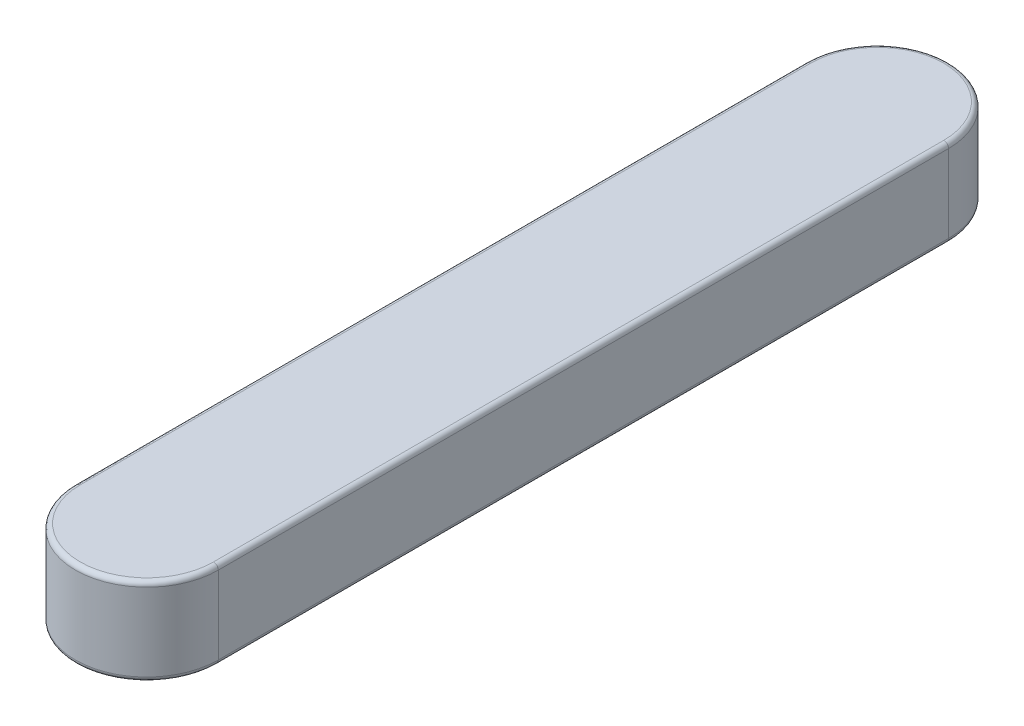
ISO-10303-21;
HEADER;
FILE_DESCRIPTION(('STEP AP214'),'2;1');
FILE_NAME('part.step','',(''),(''),'','','');
FILE_SCHEMA(('AUTOMOTIVE_DESIGN { 1 0 10303 214 1 1 1 1 }'));
ENDSEC;
DATA;
#1=APPLICATION_CONTEXT('core data for automotive mechanical design processes');
#2=APPLICATION_PROTOCOL_DEFINITION('international standard','automotive_design',2000,#1);
#3=PRODUCT_CONTEXT('',#1,'mechanical');
#4=PRODUCT('Part','Part','',(#3));
#5=PRODUCT_RELATED_PRODUCT_CATEGORY('part','',(#4));
#6=PRODUCT_DEFINITION_FORMATION('','',#4);
#7=PRODUCT_DEFINITION_CONTEXT('part definition',#1,'design');
#8=PRODUCT_DEFINITION('design','',#6,#7);
#9=PRODUCT_DEFINITION_SHAPE('','',#8);
#10=(LENGTH_UNIT() NAMED_UNIT(*) SI_UNIT(.MILLI.,.METRE.));
#11=(NAMED_UNIT(*) PLANE_ANGLE_UNIT() SI_UNIT($,.RADIAN.));
#12=(NAMED_UNIT(*) SI_UNIT($,.STERADIAN.) SOLID_ANGLE_UNIT());
#13=UNCERTAINTY_MEASURE_WITH_UNIT(LENGTH_MEASURE(1.E-05),#10,'distance_accuracy_value','');
#14=(GEOMETRIC_REPRESENTATION_CONTEXT(3) GLOBAL_UNCERTAINTY_ASSIGNED_CONTEXT((#13)) GLOBAL_UNIT_ASSIGNED_CONTEXT((#10,
#11,#12)) REPRESENTATION_CONTEXT('',''));
#15=CARTESIAN_POINT('',(0.,0.,0.));
#16=DIRECTION('',(0.,0.,1.));
#17=DIRECTION('',(1.,0.,0.));
#18=AXIS2_PLACEMENT_3D('',#15,#16,#17);
#19=CARTESIAN_POINT('',(0.,11.,0.));
#20=DIRECTION('',(0.,-1.,0.));
#21=DIRECTION('',(0.,0.,-1.));
#22=AXIS2_PLACEMENT_3D('',#19,#20,#21);
#23=CYLINDRICAL_SURFACE('',#22,9.);
#24=DIRECTION('',(0.,-1.,0.));
#25=VECTOR('',#24,1.);
#26=CARTESIAN_POINT('',(-9.,11.,0.));
#27=LINE('',#26,#25);
#28=CARTESIAN_POINT('',(-9.,10.4,0.));
#29=VERTEX_POINT('',#28);
#30=CARTESIAN_POINT('',(-9.,0.6,0.));
#31=VERTEX_POINT('',#30);
#32=EDGE_CURVE('E172',#29,#31,#27,.T.);
#33=ORIENTED_EDGE('',*,*,#32,.T.);
#34=CARTESIAN_POINT('',(0.,0.6,0.));
#35=DIRECTION('',(0.,1.,0.));
#36=DIRECTION('',(0.,0.,1.));
#37=AXIS2_PLACEMENT_3D('',#34,#35,#36);
#38=CIRCLE('',#37,9.);
#39=CARTESIAN_POINT('',(9.,0.6,0.));
#40=VERTEX_POINT('',#39);
#41=EDGE_CURVE('E186',#31,#40,#38,.T.);
#42=ORIENTED_EDGE('',*,*,#41,.T.);
#43=DIRECTION('',(0.,-1.,0.));
#44=VECTOR('',#43,1.);
#45=CARTESIAN_POINT('',(9.,11.,0.));
#46=LINE('',#45,#44);
#47=CARTESIAN_POINT('',(9.,10.4,0.));
#48=VERTEX_POINT('',#47);
#49=EDGE_CURVE('E141',#48,#40,#46,.T.);
#50=ORIENTED_EDGE('',*,*,#49,.F.);
#51=CARTESIAN_POINT('',(0.,10.4,0.));
#52=DIRECTION('',(0.,1.,0.));
#53=DIRECTION('',(0.,0.,1.));
#54=AXIS2_PLACEMENT_3D('',#51,#52,#53);
#55=CIRCLE('',#54,9.);
#56=EDGE_CURVE('E189',#48,#29,#55,.F.);
#57=ORIENTED_EDGE('',*,*,#56,.T.);
#58=EDGE_LOOP('',(#33,#42,#50,#57));
#59=FACE_BOUND('',#58,.T.);
#60=ADVANCED_FACE('F51',(#59),#23,.T.);
#61=CARTESIAN_POINT('',(9.,11.,0.));
#62=DIRECTION('',(-1.,0.,0.));
#63=DIRECTION('',(0.,0.,1.));
#64=AXIS2_PLACEMENT_3D('',#61,#62,#63);
#65=PLANE('',#64);
#66=ORIENTED_EDGE('',*,*,#49,.T.);
#67=DIRECTION('',(0.,0.,-1.));
#68=VECTOR('',#67,1.);
#69=CARTESIAN_POINT('',(9.,0.6,0.));
#70=LINE('',#69,#68);
#71=CARTESIAN_POINT('',(9.,0.6,-92.));
#72=VERTEX_POINT('',#71);
#73=EDGE_CURVE('E139',#40,#72,#70,.T.);
#74=ORIENTED_EDGE('',*,*,#73,.T.);
#75=DIRECTION('',(0.,-1.,0.));
#76=VECTOR('',#75,1.);
#77=CARTESIAN_POINT('',(9.,11.,-92.));
#78=LINE('',#77,#76);
#79=CARTESIAN_POINT('',(9.,10.4,-92.));
#80=VERTEX_POINT('',#79);
#81=EDGE_CURVE('E121',#80,#72,#78,.T.);
#82=ORIENTED_EDGE('',*,*,#81,.F.);
#83=DIRECTION('',(0.,0.,-1.));
#84=VECTOR('',#83,1.);
#85=CARTESIAN_POINT('',(9.,10.4,0.));
#86=LINE('',#85,#84);
#87=EDGE_CURVE('E136',#80,#48,#86,.F.);
#88=ORIENTED_EDGE('',*,*,#87,.T.);
#89=EDGE_LOOP('',(#66,#74,#82,#88));
#90=FACE_BOUND('',#89,.T.);
#91=ADVANCED_FACE('F135',(#90),#65,.F.);
#92=CARTESIAN_POINT('',(0.,11.,-92.));
#93=DIRECTION('',(0.,-1.,0.));
#94=DIRECTION('',(0.,0.,-1.));
#95=AXIS2_PLACEMENT_3D('',#92,#93,#94);
#96=CYLINDRICAL_SURFACE('',#95,9.);
#97=ORIENTED_EDGE('',*,*,#81,.T.);
#98=CARTESIAN_POINT('',(0.,0.6,-92.));
#99=DIRECTION('',(0.,1.,0.));
#100=DIRECTION('',(0.,0.,1.));
#101=AXIS2_PLACEMENT_3D('',#98,#99,#100);
#102=CIRCLE('',#101,9.);
#103=CARTESIAN_POINT('',(-9.,0.6,-92.));
#104=VERTEX_POINT('',#103);
#105=EDGE_CURVE('E128',#72,#104,#102,.T.);
#106=ORIENTED_EDGE('',*,*,#105,.T.);
#107=DIRECTION('',(0.,-1.,0.));
#108=VECTOR('',#107,1.);
#109=CARTESIAN_POINT('',(-9.,11.,-92.));
#110=LINE('',#109,#108);
#111=CARTESIAN_POINT('',(-9.,10.4,-92.));
#112=VERTEX_POINT('',#111);
#113=EDGE_CURVE('E123',#112,#104,#110,.T.);
#114=ORIENTED_EDGE('',*,*,#113,.F.);
#115=CARTESIAN_POINT('',(0.,10.4,-92.));
#116=DIRECTION('',(0.,1.,0.));
#117=DIRECTION('',(0.,0.,1.));
#118=AXIS2_PLACEMENT_3D('',#115,#116,#117);
#119=CIRCLE('',#118,9.);
#120=EDGE_CURVE('E118',#112,#80,#119,.F.);
#121=ORIENTED_EDGE('',*,*,#120,.T.);
#122=EDGE_LOOP('',(#97,#106,#114,#121));
#123=FACE_BOUND('',#122,.T.);
#124=ADVANCED_FACE('F120',(#123),#96,.T.);
#125=CARTESIAN_POINT('',(-9.,11.,0.));
#126=DIRECTION('',(1.,0.,0.));
#127=DIRECTION('',(0.,0.,-1.));
#128=AXIS2_PLACEMENT_3D('',#125,#126,#127);
#129=PLANE('',#128);
#130=ORIENTED_EDGE('',*,*,#113,.T.);
#131=DIRECTION('',(0.,0.,1.));
#132=VECTOR('',#131,1.);
#133=CARTESIAN_POINT('',(-9.,0.6,0.));
#134=LINE('',#133,#132);
#135=EDGE_CURVE('E192',#104,#31,#134,.T.);
#136=ORIENTED_EDGE('',*,*,#135,.T.);
#137=ORIENTED_EDGE('',*,*,#32,.F.);
#138=DIRECTION('',(0.,0.,1.));
#139=VECTOR('',#138,1.);
#140=CARTESIAN_POINT('',(-9.,10.4,-92.));
#141=LINE('',#140,#139);
#142=EDGE_CURVE('E195',#29,#112,#141,.F.);
#143=ORIENTED_EDGE('',*,*,#142,.T.);
#144=EDGE_LOOP('',(#130,#136,#137,#143));
#145=FACE_BOUND('',#144,.T.);
#146=ADVANCED_FACE('F244',(#145),#129,.F.);
#147=CARTESIAN_POINT('',(0.,11.,0.));
#148=DIRECTION('',(0.,1.,0.));
#149=DIRECTION('',(0.,0.,1.));
#150=AXIS2_PLACEMENT_3D('',#147,#148,#149);
#151=PLANE('',#150);
#152=CARTESIAN_POINT('',(0.,11.,-92.));
#153=DIRECTION('',(0.,1.,0.));
#154=DIRECTION('',(0.,0.,1.));
#155=AXIS2_PLACEMENT_3D('',#152,#153,#154);
#156=CIRCLE('',#155,8.4);
#157=CARTESIAN_POINT('',(8.4,11.,-92.));
#158=VERTEX_POINT('',#157);
#159=CARTESIAN_POINT('',(-8.4,11.,-92.));
#160=VERTEX_POINT('',#159);
#161=EDGE_CURVE('E61',#158,#160,#156,.T.);
#162=ORIENTED_EDGE('',*,*,#161,.T.);
#163=DIRECTION('',(0.,0.,1.));
#164=VECTOR('',#163,1.);
#165=CARTESIAN_POINT('',(-8.4,11.,0.));
#166=LINE('',#165,#164);
#167=CARTESIAN_POINT('',(-8.4,11.,0.));
#168=VERTEX_POINT('',#167);
#169=EDGE_CURVE('E11',#160,#168,#166,.T.);
#170=ORIENTED_EDGE('',*,*,#169,.T.);
#171=CARTESIAN_POINT('',(0.,11.,0.));
#172=DIRECTION('',(0.,1.,0.));
#173=DIRECTION('',(0.,0.,1.));
#174=AXIS2_PLACEMENT_3D('',#171,#172,#173);
#175=CIRCLE('',#174,8.4);
#176=CARTESIAN_POINT('',(8.4,11.,0.));
#177=VERTEX_POINT('',#176);
#178=EDGE_CURVE('E183',#168,#177,#175,.T.);
#179=ORIENTED_EDGE('',*,*,#178,.T.);
#180=DIRECTION('',(0.,0.,-1.));
#181=VECTOR('',#180,1.);
#182=CARTESIAN_POINT('',(8.4,11.,-92.));
#183=LINE('',#182,#181);
#184=EDGE_CURVE('E72',#177,#158,#183,.T.);
#185=ORIENTED_EDGE('',*,*,#184,.T.);
#186=EDGE_LOOP('',(#162,#170,#179,#185));
#187=FACE_BOUND('',#186,.T.);
#188=ADVANCED_FACE('F250',(#187),#151,.T.);
#189=CARTESIAN_POINT('',(0.,0.,0.));
#190=DIRECTION('',(0.,1.,0.));
#191=DIRECTION('',(0.,0.,1.));
#192=AXIS2_PLACEMENT_3D('',#189,#190,#191);
#193=PLANE('',#192);
#194=CARTESIAN_POINT('',(0.,0.,-92.));
#195=DIRECTION('',(0.,1.,0.));
#196=DIRECTION('',(0.,0.,1.));
#197=AXIS2_PLACEMENT_3D('',#194,#195,#196);
#198=CIRCLE('',#197,8.4);
#199=CARTESIAN_POINT('',(-8.4,0.,-92.));
#200=VERTEX_POINT('',#199);
#201=CARTESIAN_POINT('',(8.4,0.,-92.));
#202=VERTEX_POINT('',#201);
#203=EDGE_CURVE('E203',#200,#202,#198,.F.);
#204=ORIENTED_EDGE('',*,*,#203,.T.);
#205=DIRECTION('',(0.,0.,-1.));
#206=VECTOR('',#205,1.);
#207=CARTESIAN_POINT('',(8.4,0.,0.));
#208=LINE('',#207,#206);
#209=CARTESIAN_POINT('',(8.4,0.,0.));
#210=VERTEX_POINT('',#209);
#211=EDGE_CURVE('E129',#202,#210,#208,.F.);
#212=ORIENTED_EDGE('',*,*,#211,.T.);
#213=CARTESIAN_POINT('',(0.,0.,0.));
#214=DIRECTION('',(0.,1.,0.));
#215=DIRECTION('',(0.,0.,1.));
#216=AXIS2_PLACEMENT_3D('',#213,#214,#215);
#217=CIRCLE('',#216,8.4);
#218=CARTESIAN_POINT('',(-8.4,0.,0.));
#219=VERTEX_POINT('',#218);
#220=EDGE_CURVE('E209',#210,#219,#217,.F.);
#221=ORIENTED_EDGE('',*,*,#220,.T.);
#222=DIRECTION('',(0.,0.,1.));
#223=VECTOR('',#222,1.);
#224=CARTESIAN_POINT('',(-8.4,0.,0.));
#225=LINE('',#224,#223);
#226=EDGE_CURVE('E206',#219,#200,#225,.F.);
#227=ORIENTED_EDGE('',*,*,#226,.T.);
#228=EDGE_LOOP('',(#204,#212,#221,#227));
#229=FACE_BOUND('',#228,.T.);
#230=ADVANCED_FACE('F252',(#229),#193,.F.);
#231=CARTESIAN_POINT('',(-8.4,0.6,0.));
#232=DIRECTION('',(0.,0.,1.));
#233=DIRECTION('',(1.,0.,0.));
#234=AXIS2_PLACEMENT_3D('',#231,#232,#233);
#235=CYLINDRICAL_SURFACE('',#234,0.6);
#236=CARTESIAN_POINT('',(-8.4,0.6,-92.));
#237=DIRECTION('',(0.,0.,-1.));
#238=DIRECTION('',(-1.,0.,0.));
#239=AXIS2_PLACEMENT_3D('',#236,#237,#238);
#240=CIRCLE('',#239,0.6);
#241=EDGE_CURVE('E173',#200,#104,#240,.T.);
#242=ORIENTED_EDGE('',*,*,#241,.F.);
#243=ORIENTED_EDGE('',*,*,#226,.F.);
#244=CARTESIAN_POINT('',(-8.4,0.6,0.));
#245=DIRECTION('',(0.,0.,1.));
#246=DIRECTION('',(1.,0.,0.));
#247=AXIS2_PLACEMENT_3D('',#244,#245,#246);
#248=CIRCLE('',#247,0.6);
#249=EDGE_CURVE('E168',#31,#219,#248,.T.);
#250=ORIENTED_EDGE('',*,*,#249,.F.);
#251=ORIENTED_EDGE('',*,*,#135,.F.);
#252=EDGE_LOOP('',(#242,#243,#250,#251));
#253=FACE_BOUND('',#252,.T.);
#254=ADVANCED_FACE('F231',(#253),#235,.T.);
#255=CARTESIAN_POINT('',(0.,0.6,0.));
#256=DIRECTION('',(0.,1.,0.));
#257=DIRECTION('',(0.,0.,1.));
#258=AXIS2_PLACEMENT_3D('',#255,#256,#257);
#259=TOROIDAL_SURFACE('',#258,8.4,0.6);
#260=ORIENTED_EDGE('',*,*,#249,.T.);
#261=ORIENTED_EDGE('',*,*,#220,.F.);
#262=CARTESIAN_POINT('',(8.4,0.6,0.));
#263=DIRECTION('',(0.,0.,-1.));
#264=DIRECTION('',(-1.,0.,0.));
#265=AXIS2_PLACEMENT_3D('',#262,#263,#264);
#266=CIRCLE('',#265,0.6);
#267=EDGE_CURVE('E156',#40,#210,#266,.T.);
#268=ORIENTED_EDGE('',*,*,#267,.F.);
#269=ORIENTED_EDGE('',*,*,#41,.F.);
#270=EDGE_LOOP('',(#260,#261,#268,#269));
#271=FACE_BOUND('',#270,.T.);
#272=ADVANCED_FACE('F235',(#271),#259,.T.);
#273=CARTESIAN_POINT('',(0.,0.6,-92.));
#274=DIRECTION('',(0.,1.,0.));
#275=DIRECTION('',(0.,0.,1.));
#276=AXIS2_PLACEMENT_3D('',#273,#274,#275);
#277=TOROIDAL_SURFACE('',#276,8.4,0.6);
#278=ORIENTED_EDGE('',*,*,#241,.T.);
#279=ORIENTED_EDGE('',*,*,#105,.F.);
#280=CARTESIAN_POINT('',(8.4,0.6,-92.));
#281=DIRECTION('',(0.,0.,1.));
#282=DIRECTION('',(1.,0.,0.));
#283=AXIS2_PLACEMENT_3D('',#280,#281,#282);
#284=CIRCLE('',#283,0.6);
#285=EDGE_CURVE('E152',#202,#72,#284,.T.);
#286=ORIENTED_EDGE('',*,*,#285,.F.);
#287=ORIENTED_EDGE('',*,*,#203,.F.);
#288=EDGE_LOOP('',(#278,#279,#286,#287));
#289=FACE_BOUND('',#288,.T.);
#290=ADVANCED_FACE('F243',(#289),#277,.T.);
#291=CARTESIAN_POINT('',(8.4,0.6,0.));
#292=DIRECTION('',(0.,0.,-1.));
#293=DIRECTION('',(-1.,0.,0.));
#294=AXIS2_PLACEMENT_3D('',#291,#292,#293);
#295=CYLINDRICAL_SURFACE('',#294,0.6);
#296=ORIENTED_EDGE('',*,*,#267,.T.);
#297=ORIENTED_EDGE('',*,*,#211,.F.);
#298=ORIENTED_EDGE('',*,*,#285,.T.);
#299=ORIENTED_EDGE('',*,*,#73,.F.);
#300=EDGE_LOOP('',(#296,#297,#298,#299));
#301=FACE_BOUND('',#300,.T.);
#302=ADVANCED_FACE('F238',(#301),#295,.T.);
#303=CARTESIAN_POINT('',(8.4,10.4,0.));
#304=DIRECTION('',(0.,0.,1.));
#305=DIRECTION('',(1.,0.,0.));
#306=AXIS2_PLACEMENT_3D('',#303,#304,#305);
#307=CYLINDRICAL_SURFACE('',#306,0.6);
#308=CARTESIAN_POINT('',(8.4,10.4,0.));
#309=DIRECTION('',(0.,0.,1.));
#310=DIRECTION('',(1.,0.,0.));
#311=AXIS2_PLACEMENT_3D('',#308,#309,#310);
#312=CIRCLE('',#311,0.6);
#313=EDGE_CURVE('E146',#48,#177,#312,.T.);
#314=ORIENTED_EDGE('',*,*,#313,.F.);
#315=ORIENTED_EDGE('',*,*,#87,.F.);
#316=CARTESIAN_POINT('',(8.4,10.4,-92.));
#317=DIRECTION('',(0.,0.,-1.));
#318=DIRECTION('',(-1.,0.,0.));
#319=AXIS2_PLACEMENT_3D('',#316,#317,#318);
#320=CIRCLE('',#319,0.6);
#321=EDGE_CURVE('E55',#158,#80,#320,.T.);
#322=ORIENTED_EDGE('',*,*,#321,.F.);
#323=ORIENTED_EDGE('',*,*,#184,.F.);
#324=EDGE_LOOP('',(#314,#315,#322,#323));
#325=FACE_BOUND('',#324,.T.);
#326=ADVANCED_FACE('F53',(#325),#307,.T.);
#327=CARTESIAN_POINT('',(0.,10.4,-92.));
#328=DIRECTION('',(0.,1.,0.));
#329=DIRECTION('',(0.,0.,1.));
#330=AXIS2_PLACEMENT_3D('',#327,#328,#329);
#331=TOROIDAL_SURFACE('',#330,8.4,0.6);
#332=ORIENTED_EDGE('',*,*,#321,.T.);
#333=ORIENTED_EDGE('',*,*,#120,.F.);
#334=CARTESIAN_POINT('',(-8.4,10.4,-92.));
#335=DIRECTION('',(0.,0.,1.));
#336=DIRECTION('',(1.,0.,0.));
#337=AXIS2_PLACEMENT_3D('',#334,#335,#336);
#338=CIRCLE('',#337,0.6);
#339=EDGE_CURVE('E158',#160,#112,#338,.T.);
#340=ORIENTED_EDGE('',*,*,#339,.F.);
#341=ORIENTED_EDGE('',*,*,#161,.F.);
#342=EDGE_LOOP('',(#332,#333,#340,#341));
#343=FACE_BOUND('',#342,.T.);
#344=ADVANCED_FACE('F150',(#343),#331,.T.);
#345=CARTESIAN_POINT('',(0.,10.4,0.));
#346=DIRECTION('',(0.,1.,0.));
#347=DIRECTION('',(0.,0.,1.));
#348=AXIS2_PLACEMENT_3D('',#345,#346,#347);
#349=TOROIDAL_SURFACE('',#348,8.4,0.6);
#350=ORIENTED_EDGE('',*,*,#313,.T.);
#351=ORIENTED_EDGE('',*,*,#178,.F.);
#352=CARTESIAN_POINT('',(-8.4,10.4,0.));
#353=DIRECTION('',(0.,0.,-1.));
#354=DIRECTION('',(-1.,0.,0.));
#355=AXIS2_PLACEMENT_3D('',#352,#353,#354);
#356=CIRCLE('',#355,0.6);
#357=EDGE_CURVE('E163',#29,#168,#356,.T.);
#358=ORIENTED_EDGE('',*,*,#357,.F.);
#359=ORIENTED_EDGE('',*,*,#56,.F.);
#360=EDGE_LOOP('',(#350,#351,#358,#359));
#361=FACE_BOUND('',#360,.T.);
#362=ADVANCED_FACE('F249',(#361),#349,.T.);
#363=CARTESIAN_POINT('',(-8.4,10.4,0.));
#364=DIRECTION('',(0.,0.,-1.));
#365=DIRECTION('',(-1.,0.,0.));
#366=AXIS2_PLACEMENT_3D('',#363,#364,#365);
#367=CYLINDRICAL_SURFACE('',#366,0.6);
#368=ORIENTED_EDGE('',*,*,#339,.T.);
#369=ORIENTED_EDGE('',*,*,#142,.F.);
#370=ORIENTED_EDGE('',*,*,#357,.T.);
#371=ORIENTED_EDGE('',*,*,#169,.F.);
#372=EDGE_LOOP('',(#368,#369,#370,#371));
#373=FACE_BOUND('',#372,.T.);
#374=ADVANCED_FACE('F247',(#373),#367,.T.);
#375=CLOSED_SHELL('',(#60,#91,#124,#146,#188,#230,#254,#272,#290,#302,#326,#344,#362,#374));
#376=MANIFOLD_SOLID_BREP('B2',#375);
#377=ADVANCED_BREP_SHAPE_REPRESENTATION('',(#18,#376),#14);
#378=SHAPE_DEFINITION_REPRESENTATION(#9,#377);
ENDSEC;
END-ISO-10303-21;
